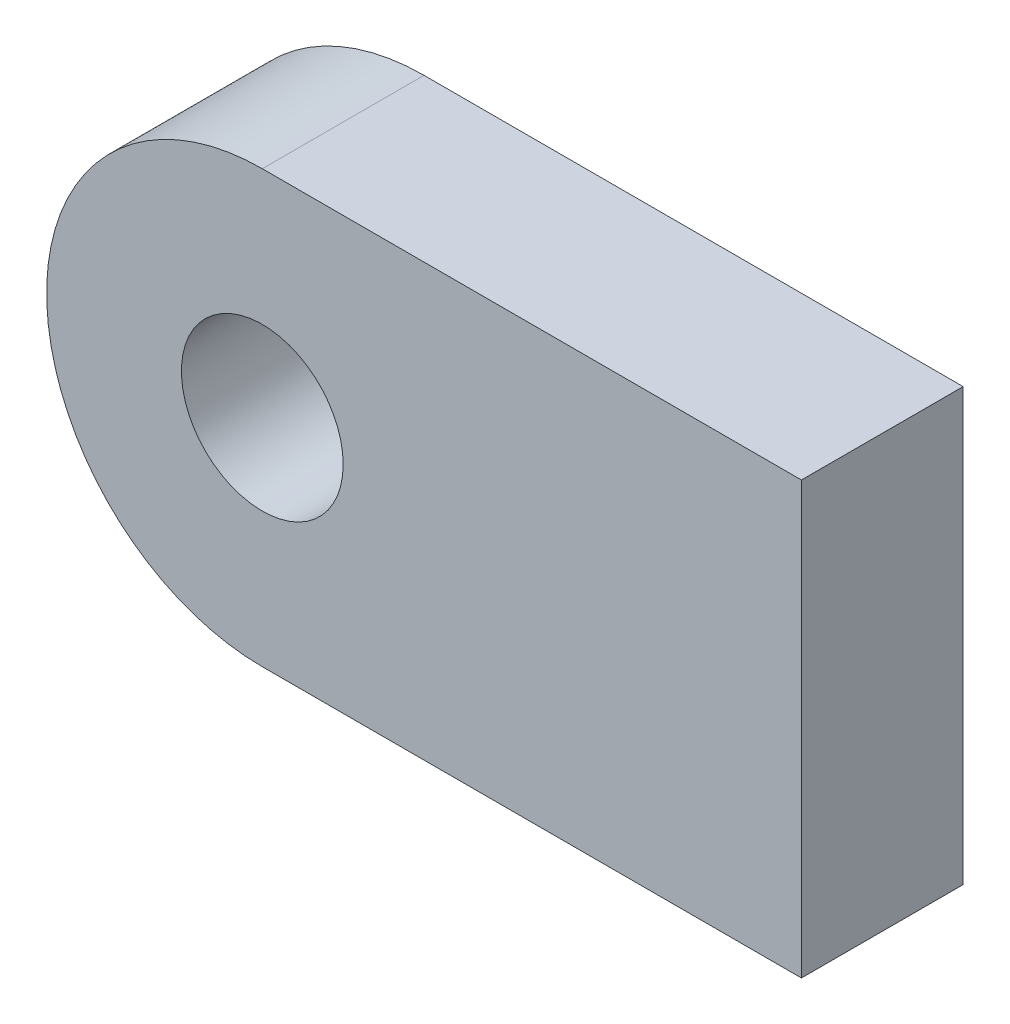
ISO-10303-21;
HEADER;
FILE_DESCRIPTION(('STEP AP214'),'2;1');
FILE_NAME('part.step','',(''),(''),'','','');
FILE_SCHEMA(('AUTOMOTIVE_DESIGN { 1 0 10303 214 1 1 1 1 }'));
ENDSEC;
DATA;
#1=APPLICATION_CONTEXT('core data for automotive mechanical design processes');
#2=APPLICATION_PROTOCOL_DEFINITION('international standard','automotive_design',2000,#1);
#3=PRODUCT_CONTEXT('',#1,'mechanical');
#4=PRODUCT('Part','Part','',(#3));
#5=PRODUCT_RELATED_PRODUCT_CATEGORY('part','',(#4));
#6=PRODUCT_DEFINITION_FORMATION('','',#4);
#7=PRODUCT_DEFINITION_CONTEXT('part definition',#1,'design');
#8=PRODUCT_DEFINITION('design','',#6,#7);
#9=PRODUCT_DEFINITION_SHAPE('','',#8);
#10=(LENGTH_UNIT() NAMED_UNIT(*) SI_UNIT(.MILLI.,.METRE.));
#11=(NAMED_UNIT(*) PLANE_ANGLE_UNIT() SI_UNIT($,.RADIAN.));
#12=(NAMED_UNIT(*) SI_UNIT($,.STERADIAN.) SOLID_ANGLE_UNIT());
#13=UNCERTAINTY_MEASURE_WITH_UNIT(LENGTH_MEASURE(1.E-05),#10,'distance_accuracy_value','');
#14=(GEOMETRIC_REPRESENTATION_CONTEXT(3) GLOBAL_UNCERTAINTY_ASSIGNED_CONTEXT((#13)) GLOBAL_UNIT_ASSIGNED_CONTEXT((#10,
#11,#12)) REPRESENTATION_CONTEXT('',''));
#15=CARTESIAN_POINT('',(0.,0.,0.));
#16=DIRECTION('',(0.,0.,1.));
#17=DIRECTION('',(1.,0.,0.));
#18=AXIS2_PLACEMENT_3D('',#15,#16,#17);
#19=CARTESIAN_POINT('',(8.5,6.5,6.));
#20=DIRECTION('',(0.,0.,1.));
#21=DIRECTION('',(1.,0.,0.));
#22=AXIS2_PLACEMENT_3D('',#19,#20,#21);
#23=PLANE('',#22);
#24=CARTESIAN_POINT('',(8.5,6.5,6.));
#25=DIRECTION('',(0.,0.,1.));
#26=DIRECTION('',(1.,0.,0.));
#27=AXIS2_PLACEMENT_3D('',#24,#25,#26);
#28=CIRCLE('',#27,8.);
#29=CARTESIAN_POINT('',(8.5,14.5,6.));
#30=VERTEX_POINT('',#29);
#31=CARTESIAN_POINT('',(8.5,-1.5,6.));
#32=VERTEX_POINT('',#31);
#33=EDGE_CURVE('E95',#30,#32,#28,.T.);
#34=ORIENTED_EDGE('',*,*,#33,.T.);
#35=DIRECTION('',(1.,0.,0.));
#36=VECTOR('',#35,1.);
#37=CARTESIAN_POINT('',(8.5,-1.5,6.));
#38=LINE('',#37,#36);
#39=CARTESIAN_POINT('',(28.5,-1.5,6.));
#40=VERTEX_POINT('',#39);
#41=EDGE_CURVE('E90',#32,#40,#38,.T.);
#42=ORIENTED_EDGE('',*,*,#41,.T.);
#43=DIRECTION('',(0.,1.,0.));
#44=VECTOR('',#43,1.);
#45=CARTESIAN_POINT('',(28.5,-1.5,6.));
#46=LINE('',#45,#44);
#47=CARTESIAN_POINT('',(28.5,14.5,6.));
#48=VERTEX_POINT('',#47);
#49=EDGE_CURVE('E93',#40,#48,#46,.T.);
#50=ORIENTED_EDGE('',*,*,#49,.T.);
#51=DIRECTION('',(-1.,0.,0.));
#52=VECTOR('',#51,1.);
#53=CARTESIAN_POINT('',(28.5,14.5,6.));
#54=LINE('',#53,#52);
#55=EDGE_CURVE('E60',#48,#30,#54,.T.);
#56=ORIENTED_EDGE('',*,*,#55,.T.);
#57=EDGE_LOOP('',(#34,#42,#50,#56));
#58=FACE_BOUND('',#57,.T.);
#59=CARTESIAN_POINT('',(8.5,6.5,6.));
#60=DIRECTION('',(0.,0.,1.));
#61=DIRECTION('',(1.,0.,0.));
#62=AXIS2_PLACEMENT_3D('',#59,#60,#61);
#63=CIRCLE('',#62,3.);
#64=CARTESIAN_POINT('',(11.5,6.5,6.));
#65=VERTEX_POINT('',#64);
#66=EDGE_CURVE('E110',#65,#65,#63,.T.);
#67=ORIENTED_EDGE('',*,*,#66,.F.);
#68=EDGE_LOOP('',(#67));
#69=FACE_BOUND('',#68,.T.);
#70=ADVANCED_FACE('F43',(#58,#69),#23,.T.);
#71=CARTESIAN_POINT('',(8.5,6.5,0.));
#72=DIRECTION('',(0.,0.,1.));
#73=DIRECTION('',(1.,0.,0.));
#74=AXIS2_PLACEMENT_3D('',#71,#72,#73);
#75=PLANE('',#74);
#76=CARTESIAN_POINT('',(8.5,6.5,0.));
#77=DIRECTION('',(0.,0.,1.));
#78=DIRECTION('',(1.,0.,0.));
#79=AXIS2_PLACEMENT_3D('',#76,#77,#78);
#80=CIRCLE('',#79,8.);
#81=CARTESIAN_POINT('',(8.5,14.5,0.));
#82=VERTEX_POINT('',#81);
#83=CARTESIAN_POINT('',(8.5,-1.5,0.));
#84=VERTEX_POINT('',#83);
#85=EDGE_CURVE('E107',#82,#84,#80,.T.);
#86=ORIENTED_EDGE('',*,*,#85,.F.);
#87=DIRECTION('',(-1.,0.,0.));
#88=VECTOR('',#87,1.);
#89=CARTESIAN_POINT('',(28.5,14.5,0.));
#90=LINE('',#89,#88);
#91=CARTESIAN_POINT('',(28.5,14.5,0.));
#92=VERTEX_POINT('',#91);
#93=EDGE_CURVE('E83',#92,#82,#90,.T.);
#94=ORIENTED_EDGE('',*,*,#93,.F.);
#95=DIRECTION('',(0.,1.,0.));
#96=VECTOR('',#95,1.);
#97=CARTESIAN_POINT('',(28.5,-1.5,0.));
#98=LINE('',#97,#96);
#99=CARTESIAN_POINT('',(28.5,-1.5,0.));
#100=VERTEX_POINT('',#99);
#101=EDGE_CURVE('E77',#100,#92,#98,.T.);
#102=ORIENTED_EDGE('',*,*,#101,.F.);
#103=DIRECTION('',(1.,0.,0.));
#104=VECTOR('',#103,1.);
#105=CARTESIAN_POINT('',(8.5,-1.5,0.));
#106=LINE('',#105,#104);
#107=EDGE_CURVE('E99',#84,#100,#106,.T.);
#108=ORIENTED_EDGE('',*,*,#107,.F.);
#109=EDGE_LOOP('',(#86,#94,#102,#108));
#110=FACE_BOUND('',#109,.T.);
#111=CARTESIAN_POINT('',(8.5,6.5,0.));
#112=DIRECTION('',(0.,0.,1.));
#113=DIRECTION('',(1.,0.,0.));
#114=AXIS2_PLACEMENT_3D('',#111,#112,#113);
#115=CIRCLE('',#114,3.);
#116=CARTESIAN_POINT('',(11.5,6.5,0.));
#117=VERTEX_POINT('',#116);
#118=EDGE_CURVE('E122',#117,#117,#115,.T.);
#119=ORIENTED_EDGE('',*,*,#118,.T.);
#120=EDGE_LOOP('',(#119));
#121=FACE_BOUND('',#120,.T.);
#122=ADVANCED_FACE('F118',(#110,#121),#75,.F.);
#123=CARTESIAN_POINT('',(8.5,6.5,6.));
#124=DIRECTION('',(0.,0.,-1.));
#125=DIRECTION('',(-1.,0.,0.));
#126=AXIS2_PLACEMENT_3D('',#123,#124,#125);
#127=CYLINDRICAL_SURFACE('',#126,8.);
#128=ORIENTED_EDGE('',*,*,#85,.T.);
#129=DIRECTION('',(0.,0.,-1.));
#130=VECTOR('',#129,1.);
#131=CARTESIAN_POINT('',(8.5,-1.5,6.));
#132=LINE('',#131,#130);
#133=EDGE_CURVE('E13',#32,#84,#132,.T.);
#134=ORIENTED_EDGE('',*,*,#133,.F.);
#135=ORIENTED_EDGE('',*,*,#33,.F.);
#136=DIRECTION('',(0.,0.,-1.));
#137=VECTOR('',#136,1.);
#138=CARTESIAN_POINT('',(8.5,14.5,6.));
#139=LINE('',#138,#137);
#140=EDGE_CURVE('E103',#30,#82,#139,.T.);
#141=ORIENTED_EDGE('',*,*,#140,.T.);
#142=EDGE_LOOP('',(#128,#134,#135,#141));
#143=FACE_BOUND('',#142,.T.);
#144=ADVANCED_FACE('F45',(#143),#127,.T.);
#145=CARTESIAN_POINT('',(8.5,-1.5,6.));
#146=DIRECTION('',(0.,1.,0.));
#147=DIRECTION('',(0.,0.,1.));
#148=AXIS2_PLACEMENT_3D('',#145,#146,#147);
#149=PLANE('',#148);
#150=ORIENTED_EDGE('',*,*,#107,.T.);
#151=DIRECTION('',(0.,0.,-1.));
#152=VECTOR('',#151,1.);
#153=CARTESIAN_POINT('',(28.5,-1.5,6.));
#154=LINE('',#153,#152);
#155=EDGE_CURVE('E52',#40,#100,#154,.T.);
#156=ORIENTED_EDGE('',*,*,#155,.F.);
#157=ORIENTED_EDGE('',*,*,#41,.F.);
#158=ORIENTED_EDGE('',*,*,#133,.T.);
#159=EDGE_LOOP('',(#150,#156,#157,#158));
#160=FACE_BOUND('',#159,.T.);
#161=ADVANCED_FACE('F98',(#160),#149,.F.);
#162=CARTESIAN_POINT('',(28.5,-1.5,6.));
#163=DIRECTION('',(-1.,0.,0.));
#164=DIRECTION('',(0.,0.,1.));
#165=AXIS2_PLACEMENT_3D('',#162,#163,#164);
#166=PLANE('',#165);
#167=ORIENTED_EDGE('',*,*,#101,.T.);
#168=DIRECTION('',(0.,0.,-1.));
#169=VECTOR('',#168,1.);
#170=CARTESIAN_POINT('',(28.5,14.5,6.));
#171=LINE('',#170,#169);
#172=EDGE_CURVE('E100',#48,#92,#171,.T.);
#173=ORIENTED_EDGE('',*,*,#172,.F.);
#174=ORIENTED_EDGE('',*,*,#49,.F.);
#175=ORIENTED_EDGE('',*,*,#155,.T.);
#176=EDGE_LOOP('',(#167,#173,#174,#175));
#177=FACE_BOUND('',#176,.T.);
#178=ADVANCED_FACE('F101',(#177),#166,.F.);
#179=CARTESIAN_POINT('',(28.5,14.5,6.));
#180=DIRECTION('',(0.,-1.,0.));
#181=DIRECTION('',(1.,0.,0.));
#182=AXIS2_PLACEMENT_3D('',#179,#180,#181);
#183=PLANE('',#182);
#184=ORIENTED_EDGE('',*,*,#93,.T.);
#185=ORIENTED_EDGE('',*,*,#140,.F.);
#186=ORIENTED_EDGE('',*,*,#55,.F.);
#187=ORIENTED_EDGE('',*,*,#172,.T.);
#188=EDGE_LOOP('',(#184,#185,#186,#187));
#189=FACE_BOUND('',#188,.T.);
#190=ADVANCED_FACE('F115',(#189),#183,.F.);
#191=CARTESIAN_POINT('',(8.5,6.5,6.));
#192=DIRECTION('',(0.,0.,-1.));
#193=DIRECTION('',(-1.,0.,0.));
#194=AXIS2_PLACEMENT_3D('',#191,#192,#193);
#195=CYLINDRICAL_SURFACE('',#194,3.);
#196=ORIENTED_EDGE('',*,*,#66,.T.);
#197=EDGE_LOOP('',(#196));
#198=FACE_BOUND('',#197,.T.);
#199=ORIENTED_EDGE('',*,*,#118,.F.);
#200=EDGE_LOOP('',(#199));
#201=FACE_BOUND('',#200,.T.);
#202=ADVANCED_FACE('F128',(#198,#201),#195,.F.);
#203=CLOSED_SHELL('',(#70,#122,#144,#161,#178,#190,#202));
#204=MANIFOLD_SOLID_BREP('B2',#203);
#205=ADVANCED_BREP_SHAPE_REPRESENTATION('',(#18,#204),#14);
#206=SHAPE_DEFINITION_REPRESENTATION(#9,#205);
ENDSEC;
END-ISO-10303-21;
